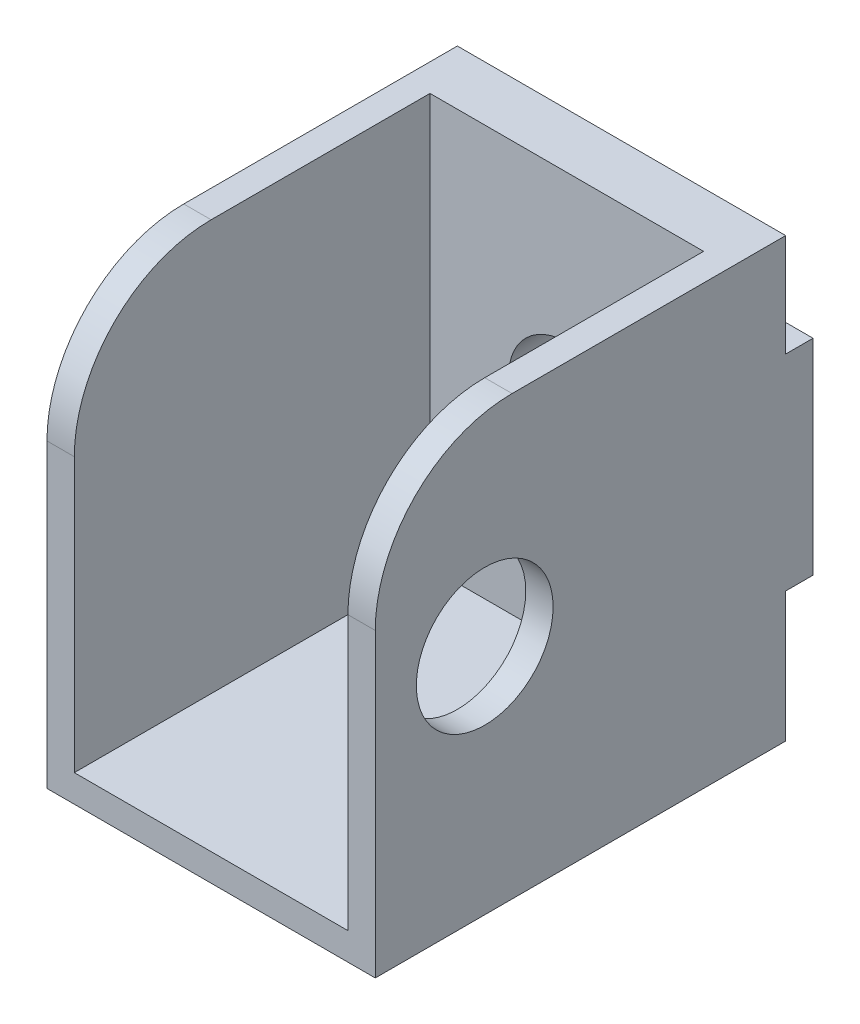
ISO-10303-21;
HEADER;
FILE_DESCRIPTION(('STEP AP214'),'2;1');
FILE_NAME('part.step','',(''),(''),'','','');
FILE_SCHEMA(('AUTOMOTIVE_DESIGN { 1 0 10303 214 1 1 1 1 }'));
ENDSEC;
DATA;
#1=APPLICATION_CONTEXT('core data for automotive mechanical design processes');
#2=APPLICATION_PROTOCOL_DEFINITION('international standard','automotive_design',2000,#1);
#3=PRODUCT_CONTEXT('',#1,'mechanical');
#4=PRODUCT('Part','Part','',(#3));
#5=PRODUCT_RELATED_PRODUCT_CATEGORY('part','',(#4));
#6=PRODUCT_DEFINITION_FORMATION('','',#4);
#7=PRODUCT_DEFINITION_CONTEXT('part definition',#1,'design');
#8=PRODUCT_DEFINITION('design','',#6,#7);
#9=PRODUCT_DEFINITION_SHAPE('','',#8);
#10=(LENGTH_UNIT() NAMED_UNIT(*) SI_UNIT(.MILLI.,.METRE.));
#11=(NAMED_UNIT(*) PLANE_ANGLE_UNIT() SI_UNIT($,.RADIAN.));
#12=(NAMED_UNIT(*) SI_UNIT($,.STERADIAN.) SOLID_ANGLE_UNIT());
#13=UNCERTAINTY_MEASURE_WITH_UNIT(LENGTH_MEASURE(1.E-05),#10,'distance_accuracy_value','');
#14=(GEOMETRIC_REPRESENTATION_CONTEXT(3) GLOBAL_UNCERTAINTY_ASSIGNED_CONTEXT((#13)) GLOBAL_UNIT_ASSIGNED_CONTEXT((#10,
#11,#12)) REPRESENTATION_CONTEXT('',''));
#15=CARTESIAN_POINT('',(0.,0.,0.));
#16=DIRECTION('',(0.,0.,1.));
#17=DIRECTION('',(1.,0.,0.));
#18=AXIS2_PLACEMENT_3D('',#15,#16,#17);
#19=CARTESIAN_POINT('',(0.,0.,0.));
#20=DIRECTION('',(0.,0.,-1.));
#21=DIRECTION('',(-1.,0.,0.));
#22=AXIS2_PLACEMENT_3D('',#19,#20,#21);
#23=PLANE('',#22);
#24=CARTESIAN_POINT('',(0.,0.,0.));
#25=DIRECTION('',(0.,0.,1.));
#26=DIRECTION('',(1.,0.,0.));
#27=AXIS2_PLACEMENT_3D('',#24,#25,#26);
#28=CIRCLE('',#27,4.25);
#29=CARTESIAN_POINT('',(4.25,0.,0.));
#30=VERTEX_POINT('',#29);
#31=EDGE_CURVE('E279',#30,#30,#28,.T.);
#32=ORIENTED_EDGE('',*,*,#31,.T.);
#33=EDGE_LOOP('',(#32));
#34=FACE_BOUND('',#33,.T.);
#35=DIRECTION('',(0.,-1.,0.));
#36=VECTOR('',#35,1.);
#37=CARTESIAN_POINT('',(-12.,15.,0.));
#38=LINE('',#37,#36);
#39=CARTESIAN_POINT('',(-12.,-7.50000000000001,0.));
#40=VERTEX_POINT('',#39);
#41=CARTESIAN_POINT('',(-12.,-17.,0.));
#42=VERTEX_POINT('',#41);
#43=EDGE_CURVE('E251',#40,#42,#38,.T.);
#44=ORIENTED_EDGE('',*,*,#43,.F.);
#45=DIRECTION('',(-1.,0.,0.));
#46=VECTOR('',#45,1.);
#47=CARTESIAN_POINT('',(-10.,-7.50000000000001,0.));
#48=LINE('',#47,#46);
#49=CARTESIAN_POINT('',(-10.,-7.50000000000001,0.));
#50=VERTEX_POINT('',#49);
#51=EDGE_CURVE('E342',#50,#40,#48,.T.);
#52=ORIENTED_EDGE('',*,*,#51,.F.);
#53=DIRECTION('',(0.,-1.,0.));
#54=VECTOR('',#53,1.);
#55=CARTESIAN_POINT('',(-10.,-7.50000000000001,0.));
#56=LINE('',#55,#54);
#57=CARTESIAN_POINT('',(-10.,7.49999999999999,0.));
#58=VERTEX_POINT('',#57);
#59=EDGE_CURVE('E179',#58,#50,#56,.T.);
#60=ORIENTED_EDGE('',*,*,#59,.F.);
#61=DIRECTION('',(1.,0.,0.));
#62=VECTOR('',#61,1.);
#63=CARTESIAN_POINT('',(-10.,7.49999999999999,0.));
#64=LINE('',#63,#62);
#65=CARTESIAN_POINT('',(-12.,7.49999999999999,0.));
#66=VERTEX_POINT('',#65);
#67=EDGE_CURVE('E175',#66,#58,#64,.T.);
#68=ORIENTED_EDGE('',*,*,#67,.F.);
#69=CARTESIAN_POINT('',(-12.,15.,0.));
#70=VERTEX_POINT('',#69);
#71=EDGE_CURVE('E247',#70,#66,#38,.T.);
#72=ORIENTED_EDGE('',*,*,#71,.F.);
#73=DIRECTION('',(-1.,0.,0.));
#74=VECTOR('',#73,1.);
#75=CARTESIAN_POINT('',(-10.,15.,0.));
#76=LINE('',#75,#74);
#77=CARTESIAN_POINT('',(12.,15.,0.));
#78=VERTEX_POINT('',#77);
#79=EDGE_CURVE('E37',#78,#70,#76,.T.);
#80=ORIENTED_EDGE('',*,*,#79,.F.);
#81=DIRECTION('',(0.,1.,0.));
#82=VECTOR('',#81,1.);
#83=CARTESIAN_POINT('',(12.,15.,0.));
#84=LINE('',#83,#82);
#85=CARTESIAN_POINT('',(12.,7.49999999999999,0.));
#86=VERTEX_POINT('',#85);
#87=EDGE_CURVE('E224',#86,#78,#84,.T.);
#88=ORIENTED_EDGE('',*,*,#87,.F.);
#89=DIRECTION('',(1.,0.,0.));
#90=VECTOR('',#89,1.);
#91=CARTESIAN_POINT('',(10.,7.49999999999999,0.));
#92=LINE('',#91,#90);
#93=CARTESIAN_POINT('',(10.,7.49999999999999,0.));
#94=VERTEX_POINT('',#93);
#95=EDGE_CURVE('E182',#94,#86,#92,.T.);
#96=ORIENTED_EDGE('',*,*,#95,.F.);
#97=DIRECTION('',(0.,1.,0.));
#98=VECTOR('',#97,1.);
#99=CARTESIAN_POINT('',(10.,-7.50000000000001,0.));
#100=LINE('',#99,#98);
#101=CARTESIAN_POINT('',(10.,-7.50000000000001,0.));
#102=VERTEX_POINT('',#101);
#103=EDGE_CURVE('E57',#102,#94,#100,.T.);
#104=ORIENTED_EDGE('',*,*,#103,.F.);
#105=DIRECTION('',(-1.,0.,0.));
#106=VECTOR('',#105,1.);
#107=CARTESIAN_POINT('',(10.,-7.50000000000001,0.));
#108=LINE('',#107,#106);
#109=CARTESIAN_POINT('',(12.,-7.5,0.));
#110=VERTEX_POINT('',#109);
#111=EDGE_CURVE('E192',#110,#102,#108,.T.);
#112=ORIENTED_EDGE('',*,*,#111,.F.);
#113=CARTESIAN_POINT('',(12.,-17.,0.));
#114=VERTEX_POINT('',#113);
#115=EDGE_CURVE('E220',#114,#110,#84,.T.);
#116=ORIENTED_EDGE('',*,*,#115,.F.);
#117=DIRECTION('',(1.,0.,0.));
#118=VECTOR('',#117,1.);
#119=CARTESIAN_POINT('',(10.,-17.,0.));
#120=LINE('',#119,#118);
#121=EDGE_CURVE('E276',#42,#114,#120,.T.);
#122=ORIENTED_EDGE('',*,*,#121,.F.);
#123=EDGE_LOOP('',(#44,#52,#60,#68,#72,#80,#88,#96,#104,#112,#116,#122));
#124=FACE_BOUND('',#123,.T.);
#125=ADVANCED_FACE('F33',(#34,#124),#23,.T.);
#126=CARTESIAN_POINT('',(0.,0.,4.));
#127=DIRECTION('',(0.,0.,-1.));
#128=DIRECTION('',(-1.,0.,0.));
#129=AXIS2_PLACEMENT_3D('',#126,#127,#128);
#130=PLANE('',#129);
#131=DIRECTION('',(0.,1.,0.));
#132=VECTOR('',#131,1.);
#133=CARTESIAN_POINT('',(10.,-15.,4.));
#134=LINE('',#133,#132);
#135=CARTESIAN_POINT('',(10.,-15.,4.));
#136=VERTEX_POINT('',#135);
#137=CARTESIAN_POINT('',(10.,15.,4.));
#138=VERTEX_POINT('',#137);
#139=EDGE_CURVE('E291',#136,#138,#134,.T.);
#140=ORIENTED_EDGE('',*,*,#139,.T.);
#141=DIRECTION('',(-1.,0.,0.));
#142=VECTOR('',#141,1.);
#143=CARTESIAN_POINT('',(-10.,15.,4.));
#144=LINE('',#143,#142);
#145=CARTESIAN_POINT('',(-10.,15.,4.));
#146=VERTEX_POINT('',#145);
#147=EDGE_CURVE('E294',#138,#146,#144,.T.);
#148=ORIENTED_EDGE('',*,*,#147,.T.);
#149=DIRECTION('',(0.,-1.,0.));
#150=VECTOR('',#149,1.);
#151=CARTESIAN_POINT('',(-10.,-15.,4.));
#152=LINE('',#151,#150);
#153=CARTESIAN_POINT('',(-10.,-15.,4.));
#154=VERTEX_POINT('',#153);
#155=EDGE_CURVE('E42',#146,#154,#152,.T.);
#156=ORIENTED_EDGE('',*,*,#155,.T.);
#157=DIRECTION('',(1.,0.,0.));
#158=VECTOR('',#157,1.);
#159=CARTESIAN_POINT('',(-10.,-15.,4.));
#160=LINE('',#159,#158);
#161=EDGE_CURVE('E11',#154,#136,#160,.T.);
#162=ORIENTED_EDGE('',*,*,#161,.T.);
#163=EDGE_LOOP('',(#140,#148,#156,#162));
#164=FACE_BOUND('',#163,.T.);
#165=CARTESIAN_POINT('',(0.,0.,4.));
#166=DIRECTION('',(0.,0.,1.));
#167=DIRECTION('',(1.,0.,0.));
#168=AXIS2_PLACEMENT_3D('',#165,#166,#167);
#169=CIRCLE('',#168,4.25);
#170=CARTESIAN_POINT('',(4.25,0.,4.));
#171=VERTEX_POINT('',#170);
#172=EDGE_CURVE('E286',#171,#171,#169,.T.);
#173=ORIENTED_EDGE('',*,*,#172,.F.);
#174=EDGE_LOOP('',(#173));
#175=FACE_BOUND('',#174,.T.);
#176=ADVANCED_FACE('F299',(#164,#175),#130,.F.);
#177=CARTESIAN_POINT('',(-10.,15.,4.));
#178=DIRECTION('',(0.,-1.,0.));
#179=DIRECTION('',(0.,0.,-1.));
#180=AXIS2_PLACEMENT_3D('',#177,#178,#179);
#181=PLANE('',#180);
#182=ORIENTED_EDGE('',*,*,#79,.T.);
#183=DIRECTION('',(0.,0.,-1.));
#184=VECTOR('',#183,1.);
#185=CARTESIAN_POINT('',(-12.,15.,0.));
#186=LINE('',#185,#184);
#187=CARTESIAN_POINT('',(-12.,15.,19.9999999999999));
#188=VERTEX_POINT('',#187);
#189=EDGE_CURVE('E258',#188,#70,#186,.T.);
#190=ORIENTED_EDGE('',*,*,#189,.F.);
#191=DIRECTION('',(1.,0.,0.));
#192=VECTOR('',#191,1.);
#193=CARTESIAN_POINT('',(-12.,15.,19.9999999999999));
#194=LINE('',#193,#192);
#195=CARTESIAN_POINT('',(-10.,15.,19.9999999999999));
#196=VERTEX_POINT('',#195);
#197=EDGE_CURVE('E261',#188,#196,#194,.T.);
#198=ORIENTED_EDGE('',*,*,#197,.T.);
#199=DIRECTION('',(0.,0.,-1.));
#200=VECTOR('',#199,1.);
#201=CARTESIAN_POINT('',(-10.,15.,0.));
#202=LINE('',#201,#200);
#203=EDGE_CURVE('E265',#196,#146,#202,.T.);
#204=ORIENTED_EDGE('',*,*,#203,.T.);
#205=ORIENTED_EDGE('',*,*,#147,.F.);
#206=DIRECTION('',(0.,0.,1.));
#207=VECTOR('',#206,1.);
#208=CARTESIAN_POINT('',(10.,15.,0.));
#209=LINE('',#208,#207);
#210=CARTESIAN_POINT('',(10.,15.,19.9999999999999));
#211=VERTEX_POINT('',#210);
#212=EDGE_CURVE('E217',#138,#211,#209,.T.);
#213=ORIENTED_EDGE('',*,*,#212,.T.);
#214=DIRECTION('',(-1.,0.,0.));
#215=VECTOR('',#214,1.);
#216=CARTESIAN_POINT('',(12.,15.,19.9999999999999));
#217=LINE('',#216,#215);
#218=CARTESIAN_POINT('',(12.,15.,19.9999999999999));
#219=VERTEX_POINT('',#218);
#220=EDGE_CURVE('E243',#219,#211,#217,.T.);
#221=ORIENTED_EDGE('',*,*,#220,.F.);
#222=DIRECTION('',(0.,0.,1.));
#223=VECTOR('',#222,1.);
#224=CARTESIAN_POINT('',(12.,15.,0.));
#225=LINE('',#224,#223);
#226=EDGE_CURVE('E223',#78,#219,#225,.T.);
#227=ORIENTED_EDGE('',*,*,#226,.F.);
#228=EDGE_LOOP('',(#182,#190,#198,#204,#205,#213,#221,#227));
#229=FACE_BOUND('',#228,.T.);
#230=ADVANCED_FACE('F35',(#229),#181,.F.);
#231=CARTESIAN_POINT('',(0.,0.,4.));
#232=DIRECTION('',(0.,0.,-1.));
#233=DIRECTION('',(-1.,0.,0.));
#234=AXIS2_PLACEMENT_3D('',#231,#232,#233);
#235=CYLINDRICAL_SURFACE('',#234,4.25);
#236=ORIENTED_EDGE('',*,*,#172,.T.);
#237=EDGE_LOOP('',(#236));
#238=FACE_BOUND('',#237,.T.);
#239=ORIENTED_EDGE('',*,*,#31,.F.);
#240=EDGE_LOOP('',(#239));
#241=FACE_BOUND('',#240,.T.);
#242=ADVANCED_FACE('F366',(#238,#241),#235,.F.);
#243=CARTESIAN_POINT('',(9.99999999999999,-17.,30.));
#244=DIRECTION('',(0.,0.,-1.));
#245=DIRECTION('',(-1.,0.,0.));
#246=AXIS2_PLACEMENT_3D('',#243,#244,#245);
#247=PLANE('',#246);
#248=DIRECTION('',(-1.,0.,0.));
#249=VECTOR('',#248,1.);
#250=CARTESIAN_POINT('',(9.99999999999999,-15.,30.));
#251=LINE('',#250,#249);
#252=CARTESIAN_POINT('',(10.,-15.,30.));
#253=VERTEX_POINT('',#252);
#254=CARTESIAN_POINT('',(-10.,-15.,30.));
#255=VERTEX_POINT('',#254);
#256=EDGE_CURVE('E282',#253,#255,#251,.T.);
#257=ORIENTED_EDGE('',*,*,#256,.T.);
#258=DIRECTION('',(0.,1.,0.));
#259=VECTOR('',#258,1.);
#260=CARTESIAN_POINT('',(-10.,4.99999999999992,30.));
#261=LINE('',#260,#259);
#262=CARTESIAN_POINT('',(-10.,4.99999999999992,30.));
#263=VERTEX_POINT('',#262);
#264=EDGE_CURVE('E246',#255,#263,#261,.T.);
#265=ORIENTED_EDGE('',*,*,#264,.T.);
#266=DIRECTION('',(1.,0.,0.));
#267=VECTOR('',#266,1.);
#268=CARTESIAN_POINT('',(-12.,4.99999999999992,30.));
#269=LINE('',#268,#267);
#270=CARTESIAN_POINT('',(-12.,4.99999999999992,30.));
#271=VERTEX_POINT('',#270);
#272=EDGE_CURVE('E270',#271,#263,#269,.T.);
#273=ORIENTED_EDGE('',*,*,#272,.F.);
#274=DIRECTION('',(0.,1.,0.));
#275=VECTOR('',#274,1.);
#276=CARTESIAN_POINT('',(-12.,4.99999999999992,30.));
#277=LINE('',#276,#275);
#278=CARTESIAN_POINT('',(-12.,-17.,30.));
#279=VERTEX_POINT('',#278);
#280=EDGE_CURVE('E254',#279,#271,#277,.T.);
#281=ORIENTED_EDGE('',*,*,#280,.F.);
#282=DIRECTION('',(-1.,0.,0.));
#283=VECTOR('',#282,1.);
#284=CARTESIAN_POINT('',(9.99999999999999,-17.,30.));
#285=LINE('',#284,#283);
#286=CARTESIAN_POINT('',(12.,-17.,30.));
#287=VERTEX_POINT('',#286);
#288=EDGE_CURVE('E274',#287,#279,#285,.T.);
#289=ORIENTED_EDGE('',*,*,#288,.F.);
#290=DIRECTION('',(0.,-1.,0.));
#291=VECTOR('',#290,1.);
#292=CARTESIAN_POINT('',(12.,4.99999999999992,30.));
#293=LINE('',#292,#291);
#294=CARTESIAN_POINT('',(12.,4.99999999999992,30.));
#295=VERTEX_POINT('',#294);
#296=EDGE_CURVE('E228',#295,#287,#293,.T.);
#297=ORIENTED_EDGE('',*,*,#296,.F.);
#298=DIRECTION('',(-1.,0.,0.));
#299=VECTOR('',#298,1.);
#300=CARTESIAN_POINT('',(12.,4.99999999999992,30.));
#301=LINE('',#300,#299);
#302=CARTESIAN_POINT('',(10.,4.99999999999992,30.));
#303=VERTEX_POINT('',#302);
#304=EDGE_CURVE('E234',#295,#303,#301,.T.);
#305=ORIENTED_EDGE('',*,*,#304,.T.);
#306=DIRECTION('',(0.,-1.,0.));
#307=VECTOR('',#306,1.);
#308=CARTESIAN_POINT('',(10.,4.99999999999992,30.));
#309=LINE('',#308,#307);
#310=EDGE_CURVE('E238',#303,#253,#309,.T.);
#311=ORIENTED_EDGE('',*,*,#310,.T.);
#312=EDGE_LOOP('',(#257,#265,#273,#281,#289,#297,#305,#311));
#313=FACE_BOUND('',#312,.T.);
#314=ADVANCED_FACE('F316',(#313),#247,.F.);
#315=CARTESIAN_POINT('',(0.,-17.,0.));
#316=DIRECTION('',(0.,-1.,0.));
#317=DIRECTION('',(0.,0.,-1.));
#318=AXIS2_PLACEMENT_3D('',#315,#316,#317);
#319=PLANE('',#318);
#320=ORIENTED_EDGE('',*,*,#121,.T.);
#321=DIRECTION('',(0.,0.,-1.));
#322=VECTOR('',#321,1.);
#323=CARTESIAN_POINT('',(12.,-17.,0.));
#324=LINE('',#323,#322);
#325=EDGE_CURVE('E231',#287,#114,#324,.T.);
#326=ORIENTED_EDGE('',*,*,#325,.F.);
#327=ORIENTED_EDGE('',*,*,#288,.T.);
#328=DIRECTION('',(0.,0.,1.));
#329=VECTOR('',#328,1.);
#330=CARTESIAN_POINT('',(-12.,-17.,0.));
#331=LINE('',#330,#329);
#332=EDGE_CURVE('E250',#42,#279,#331,.T.);
#333=ORIENTED_EDGE('',*,*,#332,.F.);
#334=EDGE_LOOP('',(#320,#326,#327,#333));
#335=FACE_BOUND('',#334,.T.);
#336=ADVANCED_FACE('F372',(#335),#319,.T.);
#337=CARTESIAN_POINT('',(0.,-15.,0.));
#338=DIRECTION('',(0.,-1.,0.));
#339=DIRECTION('',(0.,0.,-1.));
#340=AXIS2_PLACEMENT_3D('',#337,#338,#339);
#341=PLANE('',#340);
#342=ORIENTED_EDGE('',*,*,#161,.F.);
#343=DIRECTION('',(0.,0.,-1.));
#344=VECTOR('',#343,1.);
#345=CARTESIAN_POINT('',(-10.,-15.,0.));
#346=LINE('',#345,#344);
#347=EDGE_CURVE('E277',#255,#154,#346,.T.);
#348=ORIENTED_EDGE('',*,*,#347,.F.);
#349=ORIENTED_EDGE('',*,*,#256,.F.);
#350=DIRECTION('',(0.,0.,1.));
#351=VECTOR('',#350,1.);
#352=CARTESIAN_POINT('',(10.,-15.,0.));
#353=LINE('',#352,#351);
#354=EDGE_CURVE('E273',#136,#253,#353,.T.);
#355=ORIENTED_EDGE('',*,*,#354,.F.);
#356=EDGE_LOOP('',(#342,#348,#349,#355));
#357=FACE_BOUND('',#356,.T.);
#358=ADVANCED_FACE('F319',(#357),#341,.F.);
#359=CARTESIAN_POINT('',(-10.,4.99999999999999,20.));
#360=DIRECTION('',(-1.,0.,0.));
#361=DIRECTION('',(0.,0.,1.));
#362=AXIS2_PLACEMENT_3D('',#359,#360,#361);
#363=PLANE('',#362);
#364=ORIENTED_EDGE('',*,*,#264,.F.);
#365=ORIENTED_EDGE('',*,*,#347,.T.);
#366=ORIENTED_EDGE('',*,*,#155,.F.);
#367=ORIENTED_EDGE('',*,*,#203,.F.);
#368=CARTESIAN_POINT('',(-10.,4.99999999999999,20.));
#369=DIRECTION('',(-1.,0.,0.));
#370=DIRECTION('',(0.,0.,1.));
#371=AXIS2_PLACEMENT_3D('',#368,#369,#370);
#372=CIRCLE('',#371,10.);
#373=EDGE_CURVE('E263',#263,#196,#372,.T.);
#374=ORIENTED_EDGE('',*,*,#373,.F.);
#375=EDGE_LOOP('',(#364,#365,#366,#367,#374));
#376=FACE_BOUND('',#375,.T.);
#377=ADVANCED_FACE('F305',(#376),#363,.F.);
#378=CARTESIAN_POINT('',(-12.,4.99999999999999,20.));
#379=DIRECTION('',(1.,0.,0.));
#380=DIRECTION('',(0.,0.,-1.));
#381=AXIS2_PLACEMENT_3D('',#378,#379,#380);
#382=CYLINDRICAL_SURFACE('',#381,10.);
#383=ORIENTED_EDGE('',*,*,#373,.T.);
#384=ORIENTED_EDGE('',*,*,#197,.F.);
#385=CARTESIAN_POINT('',(-12.,4.99999999999999,20.));
#386=DIRECTION('',(-1.,0.,0.));
#387=DIRECTION('',(0.,0.,1.));
#388=AXIS2_PLACEMENT_3D('',#385,#386,#387);
#389=CIRCLE('',#388,10.);
#390=EDGE_CURVE('E256',#271,#188,#389,.T.);
#391=ORIENTED_EDGE('',*,*,#390,.F.);
#392=ORIENTED_EDGE('',*,*,#272,.T.);
#393=EDGE_LOOP('',(#383,#384,#391,#392));
#394=FACE_BOUND('',#393,.T.);
#395=ADVANCED_FACE('F313',(#394),#382,.T.);
#396=CARTESIAN_POINT('',(-12.,4.99999999999999,20.));
#397=DIRECTION('',(-1.,0.,0.));
#398=DIRECTION('',(0.,0.,1.));
#399=AXIS2_PLACEMENT_3D('',#396,#397,#398);
#400=PLANE('',#399);
#401=ORIENTED_EDGE('',*,*,#71,.T.);
#402=DIRECTION('',(0.,0.,1.));
#403=VECTOR('',#402,1.);
#404=CARTESIAN_POINT('',(-12.,7.49999999999999,-2.));
#405=LINE('',#404,#403);
#406=CARTESIAN_POINT('',(-12.,7.49999999999999,-2.));
#407=VERTEX_POINT('',#406);
#408=EDGE_CURVE('E184',#407,#66,#405,.T.);
#409=ORIENTED_EDGE('',*,*,#408,.F.);
#410=DIRECTION('',(0.,1.,0.));
#411=VECTOR('',#410,1.);
#412=CARTESIAN_POINT('',(-12.,-7.5,-2.));
#413=LINE('',#412,#411);
#414=CARTESIAN_POINT('',(-12.,-7.5,-2.));
#415=VERTEX_POINT('',#414);
#416=EDGE_CURVE('E165',#415,#407,#413,.T.);
#417=ORIENTED_EDGE('',*,*,#416,.F.);
#418=DIRECTION('',(0.,0.,1.));
#419=VECTOR('',#418,1.);
#420=CARTESIAN_POINT('',(-12.,-7.5,-2.));
#421=LINE('',#420,#419);
#422=EDGE_CURVE('E49',#415,#40,#421,.T.);
#423=ORIENTED_EDGE('',*,*,#422,.T.);
#424=ORIENTED_EDGE('',*,*,#43,.T.);
#425=ORIENTED_EDGE('',*,*,#332,.T.);
#426=ORIENTED_EDGE('',*,*,#280,.T.);
#427=ORIENTED_EDGE('',*,*,#390,.T.);
#428=ORIENTED_EDGE('',*,*,#189,.T.);
#429=EDGE_LOOP('',(#401,#409,#417,#423,#424,#425,#426,#427,#428));
#430=FACE_BOUND('',#429,.T.);
#431=ADVANCED_FACE('F337',(#430),#400,.T.);
#432=CARTESIAN_POINT('',(10.,4.99999999999999,20.));
#433=DIRECTION('',(-1.,0.,0.));
#434=DIRECTION('',(0.,0.,1.));
#435=AXIS2_PLACEMENT_3D('',#432,#433,#434);
#436=PLANE('',#435);
#437=CARTESIAN_POINT('',(10.,0.,22.));
#438=DIRECTION('',(1.,0.,0.));
#439=DIRECTION('',(0.,0.,-1.));
#440=AXIS2_PLACEMENT_3D('',#437,#438,#439);
#441=CIRCLE('',#440,5.);
#442=CARTESIAN_POINT('',(10.,0.,17.));
#443=VERTEX_POINT('',#442);
#444=EDGE_CURVE('E213',#443,#443,#441,.T.);
#445=ORIENTED_EDGE('',*,*,#444,.T.);
#446=EDGE_LOOP('',(#445));
#447=FACE_BOUND('',#446,.T.);
#448=ORIENTED_EDGE('',*,*,#139,.F.);
#449=ORIENTED_EDGE('',*,*,#354,.T.);
#450=ORIENTED_EDGE('',*,*,#310,.F.);
#451=CARTESIAN_POINT('',(10.,4.99999999999999,20.));
#452=DIRECTION('',(1.,0.,0.));
#453=DIRECTION('',(0.,0.,1.));
#454=AXIS2_PLACEMENT_3D('',#451,#452,#453);
#455=CIRCLE('',#454,10.);
#456=EDGE_CURVE('E236',#211,#303,#455,.T.);
#457=ORIENTED_EDGE('',*,*,#456,.F.);
#458=ORIENTED_EDGE('',*,*,#212,.F.);
#459=EDGE_LOOP('',(#448,#449,#450,#457,#458));
#460=FACE_BOUND('',#459,.T.);
#461=ADVANCED_FACE('F321',(#447,#460),#436,.T.);
#462=CARTESIAN_POINT('',(12.,4.99999999999999,20.));
#463=DIRECTION('',(-1.,0.,0.));
#464=DIRECTION('',(0.,0.,1.));
#465=AXIS2_PLACEMENT_3D('',#462,#463,#464);
#466=PLANE('',#465);
#467=ORIENTED_EDGE('',*,*,#115,.T.);
#468=DIRECTION('',(0.,0.,1.));
#469=VECTOR('',#468,1.);
#470=CARTESIAN_POINT('',(12.,-7.5,-2.));
#471=LINE('',#470,#469);
#472=CARTESIAN_POINT('',(12.,-7.5,-2.));
#473=VERTEX_POINT('',#472);
#474=EDGE_CURVE('E204',#473,#110,#471,.T.);
#475=ORIENTED_EDGE('',*,*,#474,.F.);
#476=DIRECTION('',(0.,-1.,0.));
#477=VECTOR('',#476,1.);
#478=CARTESIAN_POINT('',(12.,-7.5,-2.));
#479=LINE('',#478,#477);
#480=CARTESIAN_POINT('',(12.,7.49999999999999,-2.));
#481=VERTEX_POINT('',#480);
#482=EDGE_CURVE('E194',#481,#473,#479,.T.);
#483=ORIENTED_EDGE('',*,*,#482,.F.);
#484=DIRECTION('',(0.,0.,1.));
#485=VECTOR('',#484,1.);
#486=CARTESIAN_POINT('',(12.,7.49999999999999,-2.));
#487=LINE('',#486,#485);
#488=EDGE_CURVE('E207',#481,#86,#487,.T.);
#489=ORIENTED_EDGE('',*,*,#488,.T.);
#490=ORIENTED_EDGE('',*,*,#87,.T.);
#491=ORIENTED_EDGE('',*,*,#226,.T.);
#492=CARTESIAN_POINT('',(12.,4.99999999999999,20.));
#493=DIRECTION('',(1.,0.,0.));
#494=DIRECTION('',(0.,0.,1.));
#495=AXIS2_PLACEMENT_3D('',#492,#493,#494);
#496=CIRCLE('',#495,10.);
#497=EDGE_CURVE('E226',#219,#295,#496,.T.);
#498=ORIENTED_EDGE('',*,*,#497,.T.);
#499=ORIENTED_EDGE('',*,*,#296,.T.);
#500=ORIENTED_EDGE('',*,*,#325,.T.);
#501=EDGE_LOOP('',(#467,#475,#483,#489,#490,#491,#498,#499,#500));
#502=FACE_BOUND('',#501,.T.);
#503=CARTESIAN_POINT('',(12.,0.,22.));
#504=DIRECTION('',(1.,0.,0.));
#505=DIRECTION('',(0.,0.,-1.));
#506=AXIS2_PLACEMENT_3D('',#503,#504,#505);
#507=CIRCLE('',#506,5.);
#508=CARTESIAN_POINT('',(12.,0.,17.));
#509=VERTEX_POINT('',#508);
#510=EDGE_CURVE('E214',#509,#509,#507,.T.);
#511=ORIENTED_EDGE('',*,*,#510,.F.);
#512=EDGE_LOOP('',(#511));
#513=FACE_BOUND('',#512,.T.);
#514=ADVANCED_FACE('F332',(#502,#513),#466,.F.);
#515=CARTESIAN_POINT('',(12.,4.99999999999999,20.));
#516=DIRECTION('',(-1.,0.,0.));
#517=DIRECTION('',(0.,0.,1.));
#518=AXIS2_PLACEMENT_3D('',#515,#516,#517);
#519=CYLINDRICAL_SURFACE('',#518,10.);
#520=ORIENTED_EDGE('',*,*,#456,.T.);
#521=ORIENTED_EDGE('',*,*,#304,.F.);
#522=ORIENTED_EDGE('',*,*,#497,.F.);
#523=ORIENTED_EDGE('',*,*,#220,.T.);
#524=EDGE_LOOP('',(#520,#521,#522,#523));
#525=FACE_BOUND('',#524,.T.);
#526=ADVANCED_FACE('F328',(#525),#519,.T.);
#527=CARTESIAN_POINT('',(12.,0.,22.));
#528=DIRECTION('',(-1.,0.,0.));
#529=DIRECTION('',(0.,0.,1.));
#530=AXIS2_PLACEMENT_3D('',#527,#528,#529);
#531=CYLINDRICAL_SURFACE('',#530,5.);
#532=ORIENTED_EDGE('',*,*,#510,.T.);
#533=EDGE_LOOP('',(#532));
#534=FACE_BOUND('',#533,.T.);
#535=ORIENTED_EDGE('',*,*,#444,.F.);
#536=EDGE_LOOP('',(#535));
#537=FACE_BOUND('',#536,.T.);
#538=ADVANCED_FACE('F386',(#534,#537),#531,.F.);
#539=CARTESIAN_POINT('',(10.,-7.50000000000001,-2.));
#540=DIRECTION('',(1.,0.,0.));
#541=DIRECTION('',(0.,0.,-1.));
#542=AXIS2_PLACEMENT_3D('',#539,#540,#541);
#543=PLANE('',#542);
#544=ORIENTED_EDGE('',*,*,#103,.T.);
#545=DIRECTION('',(0.,0.,1.));
#546=VECTOR('',#545,1.);
#547=CARTESIAN_POINT('',(10.,7.49999999999999,-2.));
#548=LINE('',#547,#546);
#549=CARTESIAN_POINT('',(10.,7.49999999999999,-2.));
#550=VERTEX_POINT('',#549);
#551=EDGE_CURVE('E210',#550,#94,#548,.T.);
#552=ORIENTED_EDGE('',*,*,#551,.F.);
#553=DIRECTION('',(0.,1.,0.));
#554=VECTOR('',#553,1.);
#555=CARTESIAN_POINT('',(10.,-7.50000000000001,-2.));
#556=LINE('',#555,#554);
#557=CARTESIAN_POINT('',(10.,-7.50000000000001,-2.));
#558=VERTEX_POINT('',#557);
#559=EDGE_CURVE('E188',#558,#550,#556,.T.);
#560=ORIENTED_EDGE('',*,*,#559,.F.);
#561=DIRECTION('',(0.,0.,1.));
#562=VECTOR('',#561,1.);
#563=CARTESIAN_POINT('',(10.,-7.50000000000001,-2.));
#564=LINE('',#563,#562);
#565=EDGE_CURVE('E197',#558,#102,#564,.T.);
#566=ORIENTED_EDGE('',*,*,#565,.T.);
#567=EDGE_LOOP('',(#544,#552,#560,#566));
#568=FACE_BOUND('',#567,.T.);
#569=ADVANCED_FACE('F394',(#568),#543,.F.);
#570=CARTESIAN_POINT('',(10.,7.49999999999999,-2.));
#571=DIRECTION('',(0.,-1.,0.));
#572=DIRECTION('',(0.,0.,-1.));
#573=AXIS2_PLACEMENT_3D('',#570,#571,#572);
#574=PLANE('',#573);
#575=ORIENTED_EDGE('',*,*,#95,.T.);
#576=ORIENTED_EDGE('',*,*,#488,.F.);
#577=DIRECTION('',(1.,0.,0.));
#578=VECTOR('',#577,1.);
#579=CARTESIAN_POINT('',(10.,7.49999999999999,-2.));
#580=LINE('',#579,#578);
#581=EDGE_CURVE('E191',#550,#481,#580,.T.);
#582=ORIENTED_EDGE('',*,*,#581,.F.);
#583=ORIENTED_EDGE('',*,*,#551,.T.);
#584=EDGE_LOOP('',(#575,#576,#582,#583));
#585=FACE_BOUND('',#584,.T.);
#586=ADVANCED_FACE('F398',(#585),#574,.F.);
#587=CARTESIAN_POINT('',(10.,-7.50000000000001,-2.));
#588=DIRECTION('',(0.,1.,0.));
#589=DIRECTION('',(-1.,0.,0.));
#590=AXIS2_PLACEMENT_3D('',#587,#588,#589);
#591=PLANE('',#590);
#592=ORIENTED_EDGE('',*,*,#111,.T.);
#593=ORIENTED_EDGE('',*,*,#565,.F.);
#594=DIRECTION('',(-1.,0.,0.));
#595=VECTOR('',#594,1.);
#596=CARTESIAN_POINT('',(10.,-7.50000000000001,-2.));
#597=LINE('',#596,#595);
#598=EDGE_CURVE('E196',#473,#558,#597,.T.);
#599=ORIENTED_EDGE('',*,*,#598,.F.);
#600=ORIENTED_EDGE('',*,*,#474,.T.);
#601=EDGE_LOOP('',(#592,#593,#599,#600));
#602=FACE_BOUND('',#601,.T.);
#603=ADVANCED_FACE('F402',(#602),#591,.F.);
#604=CARTESIAN_POINT('',(0.,0.,-2.));
#605=DIRECTION('',(0.,0.,-1.));
#606=DIRECTION('',(-1.,0.,0.));
#607=AXIS2_PLACEMENT_3D('',#604,#605,#606);
#608=PLANE('',#607);
#609=ORIENTED_EDGE('',*,*,#559,.T.);
#610=ORIENTED_EDGE('',*,*,#581,.T.);
#611=ORIENTED_EDGE('',*,*,#482,.T.);
#612=ORIENTED_EDGE('',*,*,#598,.T.);
#613=EDGE_LOOP('',(#609,#610,#611,#612));
#614=FACE_BOUND('',#613,.T.);
#615=ADVANCED_FACE('F406',(#614),#608,.T.);
#616=CARTESIAN_POINT('',(-10.,-7.50000000000001,-2.));
#617=DIRECTION('',(-1.,0.,0.));
#618=DIRECTION('',(0.,0.,1.));
#619=AXIS2_PLACEMENT_3D('',#616,#617,#618);
#620=PLANE('',#619);
#621=ORIENTED_EDGE('',*,*,#59,.T.);
#622=DIRECTION('',(0.,0.,1.));
#623=VECTOR('',#622,1.);
#624=CARTESIAN_POINT('',(-10.,-7.50000000000001,-2.));
#625=LINE('',#624,#623);
#626=CARTESIAN_POINT('',(-10.,-7.50000000000001,-2.));
#627=VERTEX_POINT('',#626);
#628=EDGE_CURVE('E162',#627,#50,#625,.T.);
#629=ORIENTED_EDGE('',*,*,#628,.F.);
#630=DIRECTION('',(0.,-1.,0.));
#631=VECTOR('',#630,1.);
#632=CARTESIAN_POINT('',(-10.,-7.50000000000001,-2.));
#633=LINE('',#632,#631);
#634=CARTESIAN_POINT('',(-10.,7.49999999999999,-2.));
#635=VERTEX_POINT('',#634);
#636=EDGE_CURVE('E166',#635,#627,#633,.T.);
#637=ORIENTED_EDGE('',*,*,#636,.F.);
#638=DIRECTION('',(0.,0.,1.));
#639=VECTOR('',#638,1.);
#640=CARTESIAN_POINT('',(-10.,7.49999999999999,-2.));
#641=LINE('',#640,#639);
#642=EDGE_CURVE('E347',#635,#58,#641,.T.);
#643=ORIENTED_EDGE('',*,*,#642,.T.);
#644=EDGE_LOOP('',(#621,#629,#637,#643));
#645=FACE_BOUND('',#644,.T.);
#646=ADVANCED_FACE('F177',(#645),#620,.F.);
#647=CARTESIAN_POINT('',(-10.,-7.50000000000001,-2.));
#648=DIRECTION('',(0.,1.,0.));
#649=DIRECTION('',(-1.,0.,0.));
#650=AXIS2_PLACEMENT_3D('',#647,#648,#649);
#651=PLANE('',#650);
#652=ORIENTED_EDGE('',*,*,#51,.T.);
#653=ORIENTED_EDGE('',*,*,#422,.F.);
#654=DIRECTION('',(-1.,0.,0.));
#655=VECTOR('',#654,1.);
#656=CARTESIAN_POINT('',(-10.,-7.50000000000001,-2.));
#657=LINE('',#656,#655);
#658=EDGE_CURVE('E158',#627,#415,#657,.T.);
#659=ORIENTED_EDGE('',*,*,#658,.F.);
#660=ORIENTED_EDGE('',*,*,#628,.T.);
#661=EDGE_LOOP('',(#652,#653,#659,#660));
#662=FACE_BOUND('',#661,.T.);
#663=ADVANCED_FACE('F160',(#662),#651,.F.);
#664=CARTESIAN_POINT('',(-10.,7.49999999999999,-2.));
#665=DIRECTION('',(0.,-1.,0.));
#666=DIRECTION('',(0.,0.,-1.));
#667=AXIS2_PLACEMENT_3D('',#664,#665,#666);
#668=PLANE('',#667);
#669=ORIENTED_EDGE('',*,*,#67,.T.);
#670=ORIENTED_EDGE('',*,*,#642,.F.);
#671=DIRECTION('',(1.,0.,0.));
#672=VECTOR('',#671,1.);
#673=CARTESIAN_POINT('',(-10.,7.49999999999999,-2.));
#674=LINE('',#673,#672);
#675=EDGE_CURVE('E171',#407,#635,#674,.T.);
#676=ORIENTED_EDGE('',*,*,#675,.F.);
#677=ORIENTED_EDGE('',*,*,#408,.T.);
#678=EDGE_LOOP('',(#669,#670,#676,#677));
#679=FACE_BOUND('',#678,.T.);
#680=ADVANCED_FACE('F348',(#679),#668,.F.);
#681=CARTESIAN_POINT('',(0.,0.,-2.));
#682=DIRECTION('',(0.,0.,1.));
#683=DIRECTION('',(1.,0.,0.));
#684=AXIS2_PLACEMENT_3D('',#681,#682,#683);
#685=PLANE('',#684);
#686=ORIENTED_EDGE('',*,*,#636,.T.);
#687=ORIENTED_EDGE('',*,*,#658,.T.);
#688=ORIENTED_EDGE('',*,*,#416,.T.);
#689=ORIENTED_EDGE('',*,*,#675,.T.);
#690=EDGE_LOOP('',(#686,#687,#688,#689));
#691=FACE_BOUND('',#690,.T.);
#692=ADVANCED_FACE('F169',(#691),#685,.F.);
#693=CLOSED_SHELL('',(#125,#176,#230,#242,#314,#336,#358,#377,#395,#431,#461,#514,#526,#538,
#569,#586,#603,#615,#646,#663,#680,#692));
#694=MANIFOLD_SOLID_BREP('B2',#693);
#695=ADVANCED_BREP_SHAPE_REPRESENTATION('',(#18,#694),#14);
#696=SHAPE_DEFINITION_REPRESENTATION(#9,#695);
ENDSEC;
END-ISO-10303-21;
